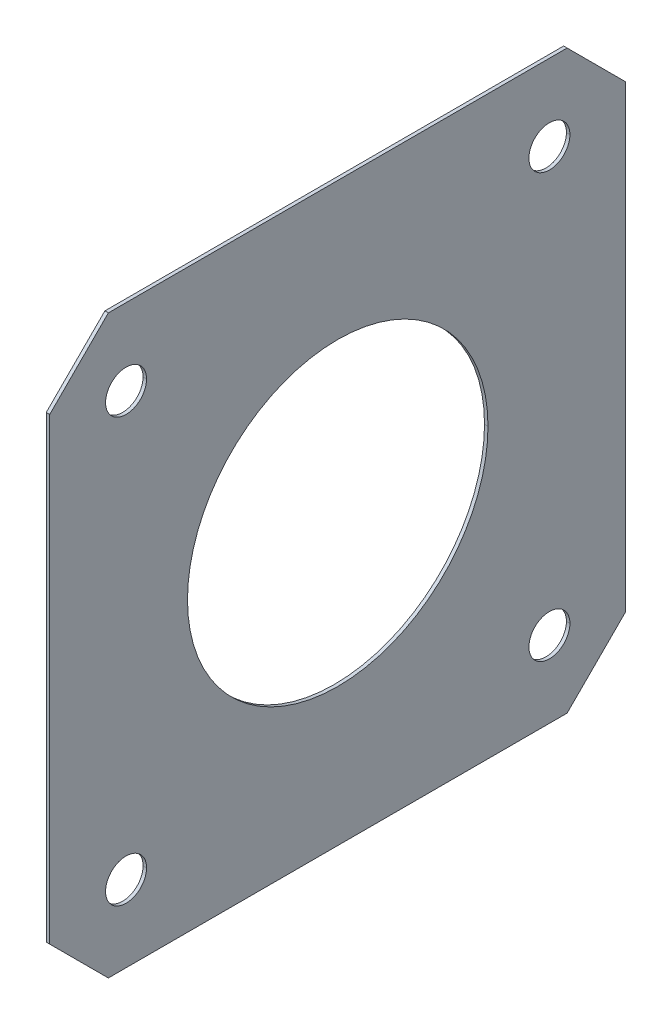
ISO-10303-21;
HEADER;
FILE_DESCRIPTION(('STEP AP214'),'2;1');
FILE_NAME('part.step','',(''),(''),'','','');
FILE_SCHEMA(('AUTOMOTIVE_DESIGN { 1 0 10303 214 1 1 1 1 }'));
ENDSEC;
DATA;
#1=APPLICATION_CONTEXT('core data for automotive mechanical design processes');
#2=APPLICATION_PROTOCOL_DEFINITION('international standard','automotive_design',2000,#1);
#3=PRODUCT_CONTEXT('',#1,'mechanical');
#4=PRODUCT('Part','Part','',(#3));
#5=PRODUCT_RELATED_PRODUCT_CATEGORY('part','',(#4));
#6=PRODUCT_DEFINITION_FORMATION('','',#4);
#7=PRODUCT_DEFINITION_CONTEXT('part definition',#1,'design');
#8=PRODUCT_DEFINITION('design','',#6,#7);
#9=PRODUCT_DEFINITION_SHAPE('','',#8);
#10=(LENGTH_UNIT() NAMED_UNIT(*) SI_UNIT(.MILLI.,.METRE.));
#11=(NAMED_UNIT(*) PLANE_ANGLE_UNIT() SI_UNIT($,.RADIAN.));
#12=(NAMED_UNIT(*) SI_UNIT($,.STERADIAN.) SOLID_ANGLE_UNIT());
#13=UNCERTAINTY_MEASURE_WITH_UNIT(LENGTH_MEASURE(1.E-05),#10,'distance_accuracy_value','');
#14=(GEOMETRIC_REPRESENTATION_CONTEXT(3) GLOBAL_UNCERTAINTY_ASSIGNED_CONTEXT((#13)) GLOBAL_UNIT_ASSIGNED_CONTEXT((#10,
#11,#12)) REPRESENTATION_CONTEXT('',''));
#15=CARTESIAN_POINT('',(0.,0.,0.));
#16=DIRECTION('',(0.,0.,1.));
#17=DIRECTION('',(1.,0.,0.));
#18=AXIS2_PLACEMENT_3D('',#15,#16,#17);
#19=CARTESIAN_POINT('',(0.254,0.,0.));
#20=DIRECTION('',(1.,0.,0.));
#21=DIRECTION('',(0.,0.,-1.));
#22=AXIS2_PLACEMENT_3D('',#19,#20,#21);
#23=PLANE('',#22);
#24=CARTESIAN_POINT('',(0.254,15.494,-15.494));
#25=DIRECTION('',(1.,0.,0.));
#26=DIRECTION('',(0.,0.,-1.));
#27=AXIS2_PLACEMENT_3D('',#24,#25,#26);
#28=CIRCLE('',#27,1.5);
#29=CARTESIAN_POINT('',(0.254,15.494,-16.994));
#30=VERTEX_POINT('',#29);
#31=CARTESIAN_POINT('',(0.254,15.494,-13.994));
#32=VERTEX_POINT('',#31);
#33=EDGE_CURVE('E11',#30,#32,#28,.T.);
#34=ORIENTED_EDGE('',*,*,#33,.F.);
#35=CARTESIAN_POINT('',(0.254,15.494,-15.494));
#36=DIRECTION('',(1.,0.,0.));
#37=DIRECTION('',(0.,0.,-1.));
#38=AXIS2_PLACEMENT_3D('',#35,#36,#37);
#39=CIRCLE('',#38,1.5);
#40=EDGE_CURVE('E24',#32,#30,#39,.T.);
#41=ORIENTED_EDGE('',*,*,#40,.F.);
#42=EDGE_LOOP('',(#34,#41));
#43=FACE_BOUND('',#42,.T.);
#44=CARTESIAN_POINT('',(0.254,15.494,15.494));
#45=DIRECTION('',(1.,0.,0.));
#46=DIRECTION('',(0.,0.,-1.));
#47=AXIS2_PLACEMENT_3D('',#44,#45,#46);
#48=CIRCLE('',#47,1.5);
#49=CARTESIAN_POINT('',(0.254,15.494,13.994));
#50=VERTEX_POINT('',#49);
#51=CARTESIAN_POINT('',(0.254,15.494,16.994));
#52=VERTEX_POINT('',#51);
#53=EDGE_CURVE('E332',#50,#52,#48,.T.);
#54=ORIENTED_EDGE('',*,*,#53,.F.);
#55=CARTESIAN_POINT('',(0.254,15.494,15.494));
#56=DIRECTION('',(1.,0.,0.));
#57=DIRECTION('',(0.,0.,-1.));
#58=AXIS2_PLACEMENT_3D('',#55,#56,#57);
#59=CIRCLE('',#58,1.5);
#60=EDGE_CURVE('E327',#52,#50,#59,.T.);
#61=ORIENTED_EDGE('',*,*,#60,.F.);
#62=EDGE_LOOP('',(#54,#61));
#63=FACE_BOUND('',#62,.T.);
#64=CARTESIAN_POINT('',(0.254,-15.494,-15.494));
#65=DIRECTION('',(1.,0.,0.));
#66=DIRECTION('',(0.,0.,-1.));
#67=AXIS2_PLACEMENT_3D('',#64,#65,#66);
#68=CIRCLE('',#67,1.5);
#69=CARTESIAN_POINT('',(0.254,-15.494,-16.994));
#70=VERTEX_POINT('',#69);
#71=CARTESIAN_POINT('',(0.254,-15.494,-13.994));
#72=VERTEX_POINT('',#71);
#73=EDGE_CURVE('E322',#70,#72,#68,.T.);
#74=ORIENTED_EDGE('',*,*,#73,.F.);
#75=CARTESIAN_POINT('',(0.254,-15.494,-15.494));
#76=DIRECTION('',(1.,0.,0.));
#77=DIRECTION('',(0.,0.,-1.));
#78=AXIS2_PLACEMENT_3D('',#75,#76,#77);
#79=CIRCLE('',#78,1.5);
#80=EDGE_CURVE('E317',#72,#70,#79,.T.);
#81=ORIENTED_EDGE('',*,*,#80,.F.);
#82=EDGE_LOOP('',(#74,#81));
#83=FACE_BOUND('',#82,.T.);
#84=CARTESIAN_POINT('',(0.254,-15.494,15.494));
#85=DIRECTION('',(1.,0.,0.));
#86=DIRECTION('',(0.,0.,-1.));
#87=AXIS2_PLACEMENT_3D('',#84,#85,#86);
#88=CIRCLE('',#87,1.5);
#89=CARTESIAN_POINT('',(0.254,-15.494,13.994));
#90=VERTEX_POINT('',#89);
#91=CARTESIAN_POINT('',(0.254,-15.494,16.994));
#92=VERTEX_POINT('',#91);
#93=EDGE_CURVE('E312',#90,#92,#88,.T.);
#94=ORIENTED_EDGE('',*,*,#93,.F.);
#95=CARTESIAN_POINT('',(0.254,-15.494,15.494));
#96=DIRECTION('',(1.,0.,0.));
#97=DIRECTION('',(0.,0.,-1.));
#98=AXIS2_PLACEMENT_3D('',#95,#96,#97);
#99=CIRCLE('',#98,1.5);
#100=EDGE_CURVE('E307',#92,#90,#99,.T.);
#101=ORIENTED_EDGE('',*,*,#100,.F.);
#102=EDGE_LOOP('',(#94,#101));
#103=FACE_BOUND('',#102,.T.);
#104=CARTESIAN_POINT('',(0.254,0.,0.));
#105=DIRECTION('',(1.,0.,0.));
#106=DIRECTION('',(0.,0.,-1.));
#107=AXIS2_PLACEMENT_3D('',#104,#105,#106);
#108=CIRCLE('',#107,10.9982);
#109=CARTESIAN_POINT('',(0.254,0.,-10.9982));
#110=VERTEX_POINT('',#109);
#111=CARTESIAN_POINT('',(0.254,0.,10.9982));
#112=VERTEX_POINT('',#111);
#113=EDGE_CURVE('E303',#110,#112,#108,.T.);
#114=ORIENTED_EDGE('',*,*,#113,.F.);
#115=CARTESIAN_POINT('',(0.254,0.,0.));
#116=DIRECTION('',(1.,0.,0.));
#117=DIRECTION('',(0.,0.,-1.));
#118=AXIS2_PLACEMENT_3D('',#115,#116,#117);
#119=CIRCLE('',#118,10.9982);
#120=EDGE_CURVE('E151',#112,#110,#119,.T.);
#121=ORIENTED_EDGE('',*,*,#120,.F.);
#122=EDGE_LOOP('',(#114,#121));
#123=FACE_BOUND('',#122,.T.);
#124=DIRECTION('',(0.,-1.,0.));
#125=VECTOR('',#124,1.);
#126=CARTESIAN_POINT('',(0.254,16.790416,21.082));
#127=LINE('',#126,#125);
#128=CARTESIAN_POINT('',(0.254,16.790416,21.082));
#129=VERTEX_POINT('',#128);
#130=CARTESIAN_POINT('',(0.254,-16.790416,21.082));
#131=VERTEX_POINT('',#130);
#132=EDGE_CURVE('E296',#129,#131,#127,.T.);
#133=ORIENTED_EDGE('',*,*,#132,.T.);
#134=DIRECTION('',(0.,-0.707106781186548,-0.707106781186548));
#135=VECTOR('',#134,1.);
#136=CARTESIAN_POINT('',(0.254,-16.790416,21.082));
#137=LINE('',#136,#135);
#138=CARTESIAN_POINT('',(0.254,-21.082,16.790416));
#139=VERTEX_POINT('',#138);
#140=EDGE_CURVE('E292',#131,#139,#137,.T.);
#141=ORIENTED_EDGE('',*,*,#140,.T.);
#142=DIRECTION('',(0.,0.,-1.));
#143=VECTOR('',#142,1.);
#144=CARTESIAN_POINT('',(0.254,-21.082,16.790416));
#145=LINE('',#144,#143);
#146=CARTESIAN_POINT('',(0.254,-21.082,-16.790416));
#147=VERTEX_POINT('',#146);
#148=EDGE_CURVE('E288',#139,#147,#145,.T.);
#149=ORIENTED_EDGE('',*,*,#148,.T.);
#150=DIRECTION('',(0.,0.707106781186548,-0.707106781186548));
#151=VECTOR('',#150,1.);
#152=CARTESIAN_POINT('',(0.254,-21.082,-16.790416));
#153=LINE('',#152,#151);
#154=CARTESIAN_POINT('',(0.254,-16.790416,-21.082));
#155=VERTEX_POINT('',#154);
#156=EDGE_CURVE('E284',#147,#155,#153,.T.);
#157=ORIENTED_EDGE('',*,*,#156,.T.);
#158=DIRECTION('',(0.,1.,0.));
#159=VECTOR('',#158,1.);
#160=CARTESIAN_POINT('',(0.254,-16.790416,-21.082));
#161=LINE('',#160,#159);
#162=CARTESIAN_POINT('',(0.254,16.790416,-21.082));
#163=VERTEX_POINT('',#162);
#164=EDGE_CURVE('E280',#155,#163,#161,.T.);
#165=ORIENTED_EDGE('',*,*,#164,.T.);
#166=DIRECTION('',(0.,0.707106781186548,0.707106781186548));
#167=VECTOR('',#166,1.);
#168=CARTESIAN_POINT('',(0.254,16.790416,-21.082));
#169=LINE('',#168,#167);
#170=CARTESIAN_POINT('',(0.254,21.082,-16.790416));
#171=VERTEX_POINT('',#170);
#172=EDGE_CURVE('E276',#163,#171,#169,.T.);
#173=ORIENTED_EDGE('',*,*,#172,.T.);
#174=DIRECTION('',(0.,0.,1.));
#175=VECTOR('',#174,1.);
#176=CARTESIAN_POINT('',(0.254,21.082,-16.790416));
#177=LINE('',#176,#175);
#178=CARTESIAN_POINT('',(0.254,21.082,16.790416));
#179=VERTEX_POINT('',#178);
#180=EDGE_CURVE('E272',#171,#179,#177,.T.);
#181=ORIENTED_EDGE('',*,*,#180,.T.);
#182=DIRECTION('',(0.,-0.707106781186548,0.707106781186548));
#183=VECTOR('',#182,1.);
#184=CARTESIAN_POINT('',(0.254,21.082,16.790416));
#185=LINE('',#184,#183);
#186=EDGE_CURVE('E268',#179,#129,#185,.T.);
#187=ORIENTED_EDGE('',*,*,#186,.T.);
#188=EDGE_LOOP('',(#133,#141,#149,#157,#165,#173,#181,#187));
#189=FACE_BOUND('',#188,.T.);
#190=ADVANCED_FACE('F16',(#43,#63,#83,#103,#123,#189),#23,.T.);
#191=CARTESIAN_POINT('',(0.254,21.082,16.790416));
#192=DIRECTION('',(0.,-0.707106781186548,-0.707106781186548));
#193=DIRECTION('',(0.,0.707106781186548,-0.707106781186548));
#194=AXIS2_PLACEMENT_3D('',#191,#192,#193);
#195=PLANE('',#194);
#196=DIRECTION('',(0.,-0.707106781186548,0.707106781186548));
#197=VECTOR('',#196,1.);
#198=CARTESIAN_POINT('',(0.,21.082,16.790416));
#199=LINE('',#198,#197);
#200=CARTESIAN_POINT('',(0.,21.082,16.790416));
#201=VERTEX_POINT('',#200);
#202=CARTESIAN_POINT('',(0.,16.790416,21.082));
#203=VERTEX_POINT('',#202);
#204=EDGE_CURVE('E264',#201,#203,#199,.T.);
#205=ORIENTED_EDGE('',*,*,#204,.T.);
#206=DIRECTION('',(-1.,0.,0.));
#207=VECTOR('',#206,1.);
#208=CARTESIAN_POINT('',(0.254,16.790416,21.082));
#209=LINE('',#208,#207);
#210=EDGE_CURVE('E259',#129,#203,#209,.T.);
#211=ORIENTED_EDGE('',*,*,#210,.F.);
#212=ORIENTED_EDGE('',*,*,#186,.F.);
#213=DIRECTION('',(-1.,0.,0.));
#214=VECTOR('',#213,1.);
#215=CARTESIAN_POINT('',(0.254,21.082,16.790416));
#216=LINE('',#215,#214);
#217=EDGE_CURVE('E255',#179,#201,#216,.T.);
#218=ORIENTED_EDGE('',*,*,#217,.T.);
#219=EDGE_LOOP('',(#205,#211,#212,#218));
#220=FACE_BOUND('',#219,.T.);
#221=ADVANCED_FACE('F594',(#220),#195,.F.);
#222=CARTESIAN_POINT('',(0.254,21.082,-16.790416));
#223=DIRECTION('',(0.,-1.,0.));
#224=DIRECTION('',(0.,0.,-1.));
#225=AXIS2_PLACEMENT_3D('',#222,#223,#224);
#226=PLANE('',#225);
#227=DIRECTION('',(0.,0.,1.));
#228=VECTOR('',#227,1.);
#229=CARTESIAN_POINT('',(0.,21.082,-16.790416));
#230=LINE('',#229,#228);
#231=CARTESIAN_POINT('',(0.,21.082,-16.790416));
#232=VERTEX_POINT('',#231);
#233=EDGE_CURVE('E250',#232,#201,#230,.T.);
#234=ORIENTED_EDGE('',*,*,#233,.T.);
#235=ORIENTED_EDGE('',*,*,#217,.F.);
#236=ORIENTED_EDGE('',*,*,#180,.F.);
#237=DIRECTION('',(-1.,0.,0.));
#238=VECTOR('',#237,1.);
#239=CARTESIAN_POINT('',(0.254,21.082,-16.790416));
#240=LINE('',#239,#238);
#241=EDGE_CURVE('E246',#171,#232,#240,.T.);
#242=ORIENTED_EDGE('',*,*,#241,.T.);
#243=EDGE_LOOP('',(#234,#235,#236,#242));
#244=FACE_BOUND('',#243,.T.);
#245=ADVANCED_FACE('F631',(#244),#226,.F.);
#246=CARTESIAN_POINT('',(0.254,16.790416,-21.082));
#247=DIRECTION('',(0.,-0.707106781186548,0.707106781186548));
#248=DIRECTION('',(0.,-0.707106781186548,-0.707106781186548));
#249=AXIS2_PLACEMENT_3D('',#246,#247,#248);
#250=PLANE('',#249);
#251=DIRECTION('',(0.,0.707106781186548,0.707106781186548));
#252=VECTOR('',#251,1.);
#253=CARTESIAN_POINT('',(0.,16.790416,-21.082));
#254=LINE('',#253,#252);
#255=CARTESIAN_POINT('',(0.,16.790416,-21.082));
#256=VERTEX_POINT('',#255);
#257=EDGE_CURVE('E241',#256,#232,#254,.T.);
#258=ORIENTED_EDGE('',*,*,#257,.T.);
#259=ORIENTED_EDGE('',*,*,#241,.F.);
#260=ORIENTED_EDGE('',*,*,#172,.F.);
#261=DIRECTION('',(-1.,0.,0.));
#262=VECTOR('',#261,1.);
#263=CARTESIAN_POINT('',(0.254,16.790416,-21.082));
#264=LINE('',#263,#262);
#265=EDGE_CURVE('E237',#163,#256,#264,.T.);
#266=ORIENTED_EDGE('',*,*,#265,.T.);
#267=EDGE_LOOP('',(#258,#259,#260,#266));
#268=FACE_BOUND('',#267,.T.);
#269=ADVANCED_FACE('F628',(#268),#250,.F.);
#270=CARTESIAN_POINT('',(0.254,-16.790416,-21.082));
#271=DIRECTION('',(0.,0.,1.));
#272=DIRECTION('',(1.,0.,0.));
#273=AXIS2_PLACEMENT_3D('',#270,#271,#272);
#274=PLANE('',#273);
#275=DIRECTION('',(0.,1.,0.));
#276=VECTOR('',#275,1.);
#277=CARTESIAN_POINT('',(0.,-16.790416,-21.082));
#278=LINE('',#277,#276);
#279=CARTESIAN_POINT('',(0.,-16.790416,-21.082));
#280=VERTEX_POINT('',#279);
#281=EDGE_CURVE('E232',#280,#256,#278,.T.);
#282=ORIENTED_EDGE('',*,*,#281,.T.);
#283=ORIENTED_EDGE('',*,*,#265,.F.);
#284=ORIENTED_EDGE('',*,*,#164,.F.);
#285=DIRECTION('',(-1.,0.,0.));
#286=VECTOR('',#285,1.);
#287=CARTESIAN_POINT('',(0.254,-16.790416,-21.082));
#288=LINE('',#287,#286);
#289=EDGE_CURVE('E228',#155,#280,#288,.T.);
#290=ORIENTED_EDGE('',*,*,#289,.T.);
#291=EDGE_LOOP('',(#282,#283,#284,#290));
#292=FACE_BOUND('',#291,.T.);
#293=ADVANCED_FACE('F621',(#292),#274,.F.);
#294=CARTESIAN_POINT('',(0.254,-21.082,-16.790416));
#295=DIRECTION('',(0.,0.707106781186548,0.707106781186548));
#296=DIRECTION('',(0.,-0.707106781186548,0.707106781186548));
#297=AXIS2_PLACEMENT_3D('',#294,#295,#296);
#298=PLANE('',#297);
#299=DIRECTION('',(0.,0.707106781186548,-0.707106781186548));
#300=VECTOR('',#299,1.);
#301=CARTESIAN_POINT('',(0.,-21.082,-16.790416));
#302=LINE('',#301,#300);
#303=CARTESIAN_POINT('',(0.,-21.082,-16.790416));
#304=VERTEX_POINT('',#303);
#305=EDGE_CURVE('E223',#304,#280,#302,.T.);
#306=ORIENTED_EDGE('',*,*,#305,.T.);
#307=ORIENTED_EDGE('',*,*,#289,.F.);
#308=ORIENTED_EDGE('',*,*,#156,.F.);
#309=DIRECTION('',(-1.,0.,0.));
#310=VECTOR('',#309,1.);
#311=CARTESIAN_POINT('',(0.254,-21.082,-16.790416));
#312=LINE('',#311,#310);
#313=EDGE_CURVE('E219',#147,#304,#312,.T.);
#314=ORIENTED_EDGE('',*,*,#313,.T.);
#315=EDGE_LOOP('',(#306,#307,#308,#314));
#316=FACE_BOUND('',#315,.T.);
#317=ADVANCED_FACE('F619',(#316),#298,.F.);
#318=CARTESIAN_POINT('',(0.254,-21.082,16.790416));
#319=DIRECTION('',(0.,1.,0.));
#320=DIRECTION('',(0.,0.,1.));
#321=AXIS2_PLACEMENT_3D('',#318,#319,#320);
#322=PLANE('',#321);
#323=DIRECTION('',(0.,0.,-1.));
#324=VECTOR('',#323,1.);
#325=CARTESIAN_POINT('',(0.,-21.082,16.790416));
#326=LINE('',#325,#324);
#327=CARTESIAN_POINT('',(0.,-21.082,16.790416));
#328=VERTEX_POINT('',#327);
#329=EDGE_CURVE('E214',#328,#304,#326,.T.);
#330=ORIENTED_EDGE('',*,*,#329,.T.);
#331=ORIENTED_EDGE('',*,*,#313,.F.);
#332=ORIENTED_EDGE('',*,*,#148,.F.);
#333=DIRECTION('',(-1.,0.,0.));
#334=VECTOR('',#333,1.);
#335=CARTESIAN_POINT('',(0.254,-21.082,16.790416));
#336=LINE('',#335,#334);
#337=EDGE_CURVE('E210',#139,#328,#336,.T.);
#338=ORIENTED_EDGE('',*,*,#337,.T.);
#339=EDGE_LOOP('',(#330,#331,#332,#338));
#340=FACE_BOUND('',#339,.T.);
#341=ADVANCED_FACE('F614',(#340),#322,.F.);
#342=CARTESIAN_POINT('',(0.254,-16.790416,21.082));
#343=DIRECTION('',(0.,0.707106781186548,-0.707106781186548));
#344=DIRECTION('',(0.,0.707106781186548,0.707106781186548));
#345=AXIS2_PLACEMENT_3D('',#342,#343,#344);
#346=PLANE('',#345);
#347=DIRECTION('',(0.,-0.707106781186548,-0.707106781186548));
#348=VECTOR('',#347,1.);
#349=CARTESIAN_POINT('',(0.,-16.790416,21.082));
#350=LINE('',#349,#348);
#351=CARTESIAN_POINT('',(0.,-16.790416,21.082));
#352=VERTEX_POINT('',#351);
#353=EDGE_CURVE('E205',#352,#328,#350,.T.);
#354=ORIENTED_EDGE('',*,*,#353,.T.);
#355=ORIENTED_EDGE('',*,*,#337,.F.);
#356=ORIENTED_EDGE('',*,*,#140,.F.);
#357=DIRECTION('',(-1.,0.,0.));
#358=VECTOR('',#357,1.);
#359=CARTESIAN_POINT('',(0.254,-16.790416,21.082));
#360=LINE('',#359,#358);
#361=EDGE_CURVE('E201',#131,#352,#360,.T.);
#362=ORIENTED_EDGE('',*,*,#361,.T.);
#363=EDGE_LOOP('',(#354,#355,#356,#362));
#364=FACE_BOUND('',#363,.T.);
#365=ADVANCED_FACE('F604',(#364),#346,.F.);
#366=CARTESIAN_POINT('',(0.254,16.790416,21.082));
#367=DIRECTION('',(0.,0.,-1.));
#368=DIRECTION('',(-1.,0.,0.));
#369=AXIS2_PLACEMENT_3D('',#366,#367,#368);
#370=PLANE('',#369);
#371=DIRECTION('',(0.,-1.,0.));
#372=VECTOR('',#371,1.);
#373=CARTESIAN_POINT('',(0.,16.790416,21.082));
#374=LINE('',#373,#372);
#375=EDGE_CURVE('E196',#203,#352,#374,.T.);
#376=ORIENTED_EDGE('',*,*,#375,.T.);
#377=ORIENTED_EDGE('',*,*,#361,.F.);
#378=ORIENTED_EDGE('',*,*,#132,.F.);
#379=ORIENTED_EDGE('',*,*,#210,.T.);
#380=EDGE_LOOP('',(#376,#377,#378,#379));
#381=FACE_BOUND('',#380,.T.);
#382=ADVANCED_FACE('F605',(#381),#370,.F.);
#383=CARTESIAN_POINT('',(0.,0.,0.));
#384=DIRECTION('',(1.,0.,0.));
#385=DIRECTION('',(0.,0.,-1.));
#386=AXIS2_PLACEMENT_3D('',#383,#384,#385);
#387=PLANE('',#386);
#388=CARTESIAN_POINT('',(0.,15.494,-15.494));
#389=DIRECTION('',(1.,0.,0.));
#390=DIRECTION('',(0.,0.,-1.));
#391=AXIS2_PLACEMENT_3D('',#388,#389,#390);
#392=CIRCLE('',#391,1.5);
#393=CARTESIAN_POINT('',(0.,15.494,-16.994));
#394=VERTEX_POINT('',#393);
#395=CARTESIAN_POINT('',(0.,15.494,-13.994));
#396=VERTEX_POINT('',#395);
#397=EDGE_CURVE('E192',#394,#396,#392,.T.);
#398=ORIENTED_EDGE('',*,*,#397,.T.);
#399=CARTESIAN_POINT('',(0.,15.494,-15.494));
#400=DIRECTION('',(1.,0.,0.));
#401=DIRECTION('',(0.,0.,-1.));
#402=AXIS2_PLACEMENT_3D('',#399,#400,#401);
#403=CIRCLE('',#402,1.5);
#404=EDGE_CURVE('E188',#396,#394,#403,.T.);
#405=ORIENTED_EDGE('',*,*,#404,.T.);
#406=EDGE_LOOP('',(#398,#405));
#407=FACE_BOUND('',#406,.T.);
#408=CARTESIAN_POINT('',(0.,15.494,15.494));
#409=DIRECTION('',(1.,0.,0.));
#410=DIRECTION('',(0.,0.,-1.));
#411=AXIS2_PLACEMENT_3D('',#408,#409,#410);
#412=CIRCLE('',#411,1.5);
#413=CARTESIAN_POINT('',(0.,15.494,13.994));
#414=VERTEX_POINT('',#413);
#415=CARTESIAN_POINT('',(0.,15.494,16.994));
#416=VERTEX_POINT('',#415);
#417=EDGE_CURVE('E184',#414,#416,#412,.T.);
#418=ORIENTED_EDGE('',*,*,#417,.T.);
#419=CARTESIAN_POINT('',(0.,15.494,15.494));
#420=DIRECTION('',(1.,0.,0.));
#421=DIRECTION('',(0.,0.,-1.));
#422=AXIS2_PLACEMENT_3D('',#419,#420,#421);
#423=CIRCLE('',#422,1.5);
#424=EDGE_CURVE('E180',#416,#414,#423,.T.);
#425=ORIENTED_EDGE('',*,*,#424,.T.);
#426=EDGE_LOOP('',(#418,#425));
#427=FACE_BOUND('',#426,.T.);
#428=CARTESIAN_POINT('',(0.,-15.494,-15.494));
#429=DIRECTION('',(1.,0.,0.));
#430=DIRECTION('',(0.,0.,-1.));
#431=AXIS2_PLACEMENT_3D('',#428,#429,#430);
#432=CIRCLE('',#431,1.5);
#433=CARTESIAN_POINT('',(0.,-15.494,-16.994));
#434=VERTEX_POINT('',#433);
#435=CARTESIAN_POINT('',(0.,-15.494,-13.994));
#436=VERTEX_POINT('',#435);
#437=EDGE_CURVE('E176',#434,#436,#432,.T.);
#438=ORIENTED_EDGE('',*,*,#437,.T.);
#439=CARTESIAN_POINT('',(0.,-15.494,-15.494));
#440=DIRECTION('',(1.,0.,0.));
#441=DIRECTION('',(0.,0.,-1.));
#442=AXIS2_PLACEMENT_3D('',#439,#440,#441);
#443=CIRCLE('',#442,1.5);
#444=EDGE_CURVE('E172',#436,#434,#443,.T.);
#445=ORIENTED_EDGE('',*,*,#444,.T.);
#446=EDGE_LOOP('',(#438,#445));
#447=FACE_BOUND('',#446,.T.);
#448=CARTESIAN_POINT('',(0.,-15.494,15.494));
#449=DIRECTION('',(1.,0.,0.));
#450=DIRECTION('',(0.,0.,-1.));
#451=AXIS2_PLACEMENT_3D('',#448,#449,#450);
#452=CIRCLE('',#451,1.5);
#453=CARTESIAN_POINT('',(0.,-15.494,13.994));
#454=VERTEX_POINT('',#453);
#455=CARTESIAN_POINT('',(0.,-15.494,16.994));
#456=VERTEX_POINT('',#455);
#457=EDGE_CURVE('E162',#454,#456,#452,.T.);
#458=ORIENTED_EDGE('',*,*,#457,.T.);
#459=CARTESIAN_POINT('',(0.,-15.494,15.494));
#460=DIRECTION('',(1.,0.,0.));
#461=DIRECTION('',(0.,0.,-1.));
#462=AXIS2_PLACEMENT_3D('',#459,#460,#461);
#463=CIRCLE('',#462,1.5);
#464=EDGE_CURVE('E160',#456,#454,#463,.T.);
#465=ORIENTED_EDGE('',*,*,#464,.T.);
#466=EDGE_LOOP('',(#458,#465));
#467=FACE_BOUND('',#466,.T.);
#468=CARTESIAN_POINT('',(0.,0.,0.));
#469=DIRECTION('',(1.,0.,0.));
#470=DIRECTION('',(0.,0.,-1.));
#471=AXIS2_PLACEMENT_3D('',#468,#469,#470);
#472=CIRCLE('',#471,10.9982);
#473=CARTESIAN_POINT('',(0.,0.,-10.9982));
#474=VERTEX_POINT('',#473);
#475=CARTESIAN_POINT('',(0.,0.,10.9982));
#476=VERTEX_POINT('',#475);
#477=EDGE_CURVE('E140',#474,#476,#472,.T.);
#478=ORIENTED_EDGE('',*,*,#477,.T.);
#479=CARTESIAN_POINT('',(0.,0.,0.));
#480=DIRECTION('',(1.,0.,0.));
#481=DIRECTION('',(0.,0.,-1.));
#482=AXIS2_PLACEMENT_3D('',#479,#480,#481);
#483=CIRCLE('',#482,10.9982);
#484=EDGE_CURVE('E135',#476,#474,#483,.T.);
#485=ORIENTED_EDGE('',*,*,#484,.T.);
#486=EDGE_LOOP('',(#478,#485));
#487=FACE_BOUND('',#486,.T.);
#488=ORIENTED_EDGE('',*,*,#375,.F.);
#489=ORIENTED_EDGE('',*,*,#204,.F.);
#490=ORIENTED_EDGE('',*,*,#233,.F.);
#491=ORIENTED_EDGE('',*,*,#257,.F.);
#492=ORIENTED_EDGE('',*,*,#281,.F.);
#493=ORIENTED_EDGE('',*,*,#305,.F.);
#494=ORIENTED_EDGE('',*,*,#329,.F.);
#495=ORIENTED_EDGE('',*,*,#353,.F.);
#496=EDGE_LOOP('',(#488,#489,#490,#491,#492,#493,#494,#495));
#497=FACE_BOUND('',#496,.T.);
#498=ADVANCED_FACE('F137',(#407,#427,#447,#467,#487,#497),#387,.F.);
#499=CARTESIAN_POINT('',(0.254,0.,0.));
#500=DIRECTION('',(1.,0.,0.));
#501=DIRECTION('',(0.,1.,0.));
#502=AXIS2_PLACEMENT_3D('',#499,#500,#501);
#503=CYLINDRICAL_SURFACE('',#502,10.9982);
#504=ORIENTED_EDGE('',*,*,#484,.F.);
#505=CARTESIAN_POINT('',(0.,0.,10.9982));
#506=DIRECTION('',(1.,0.,0.));
#507=VECTOR('',#506,1.);
#508=LINE('',#505,#507);
#509=EDGE_CURVE('E144',#476,#112,#508,.T.);
#510=ORIENTED_EDGE('',*,*,#509,.T.);
#511=ORIENTED_EDGE('',*,*,#120,.T.);
#512=CARTESIAN_POINT('',(0.,0.,-10.9982));
#513=DIRECTION('',(1.,0.,0.));
#514=VECTOR('',#513,1.);
#515=LINE('',#512,#514);
#516=EDGE_CURVE('E148',#474,#110,#515,.T.);
#517=ORIENTED_EDGE('',*,*,#516,.F.);
#518=EDGE_LOOP('',(#504,#510,#511,#517));
#519=FACE_BOUND('',#518,.T.);
#520=ADVANCED_FACE('F150',(#519),#503,.F.);
#521=CARTESIAN_POINT('',(0.254,0.,0.));
#522=DIRECTION('',(1.,0.,0.));
#523=DIRECTION('',(0.,-1.,0.));
#524=AXIS2_PLACEMENT_3D('',#521,#522,#523);
#525=CYLINDRICAL_SURFACE('',#524,10.9982);
#526=ORIENTED_EDGE('',*,*,#113,.T.);
#527=ORIENTED_EDGE('',*,*,#509,.F.);
#528=ORIENTED_EDGE('',*,*,#477,.F.);
#529=ORIENTED_EDGE('',*,*,#516,.T.);
#530=EDGE_LOOP('',(#526,#527,#528,#529));
#531=FACE_BOUND('',#530,.T.);
#532=ADVANCED_FACE('F158',(#531),#525,.F.);
#533=CARTESIAN_POINT('',(0.254,-15.494,15.494));
#534=DIRECTION('',(-1.,0.,0.));
#535=DIRECTION('',(0.,1.,0.));
#536=AXIS2_PLACEMENT_3D('',#533,#534,#535);
#537=CYLINDRICAL_SURFACE('',#536,1.5);
#538=ORIENTED_EDGE('',*,*,#464,.F.);
#539=CARTESIAN_POINT('',(0.254,-15.494,16.994));
#540=DIRECTION('',(-1.,0.,0.));
#541=VECTOR('',#540,1.);
#542=LINE('',#539,#541);
#543=EDGE_CURVE('E155',#92,#456,#542,.T.);
#544=ORIENTED_EDGE('',*,*,#543,.F.);
#545=ORIENTED_EDGE('',*,*,#100,.T.);
#546=CARTESIAN_POINT('',(0.254,-15.494,13.994));
#547=DIRECTION('',(-1.,0.,0.));
#548=VECTOR('',#547,1.);
#549=LINE('',#546,#548);
#550=EDGE_CURVE('E517',#90,#454,#549,.T.);
#551=ORIENTED_EDGE('',*,*,#550,.T.);
#552=EDGE_LOOP('',(#538,#544,#545,#551));
#553=FACE_BOUND('',#552,.T.);
#554=ADVANCED_FACE('F533',(#553),#537,.F.);
#555=CARTESIAN_POINT('',(0.254,-15.494,15.494));
#556=DIRECTION('',(-1.,0.,0.));
#557=DIRECTION('',(0.,-1.,0.));
#558=AXIS2_PLACEMENT_3D('',#555,#556,#557);
#559=CYLINDRICAL_SURFACE('',#558,1.5);
#560=ORIENTED_EDGE('',*,*,#93,.T.);
#561=ORIENTED_EDGE('',*,*,#543,.T.);
#562=ORIENTED_EDGE('',*,*,#457,.F.);
#563=ORIENTED_EDGE('',*,*,#550,.F.);
#564=EDGE_LOOP('',(#560,#561,#562,#563));
#565=FACE_BOUND('',#564,.T.);
#566=ADVANCED_FACE('F489',(#565),#559,.F.);
#567=CARTESIAN_POINT('',(0.254,-15.494,-15.494));
#568=DIRECTION('',(-1.,0.,0.));
#569=DIRECTION('',(0.,1.,0.));
#570=AXIS2_PLACEMENT_3D('',#567,#568,#569);
#571=CYLINDRICAL_SURFACE('',#570,1.5);
#572=ORIENTED_EDGE('',*,*,#444,.F.);
#573=CARTESIAN_POINT('',(0.254,-15.494,-13.994));
#574=DIRECTION('',(-1.,0.,0.));
#575=VECTOR('',#574,1.);
#576=LINE('',#573,#575);
#577=EDGE_CURVE('E475',#72,#436,#576,.T.);
#578=ORIENTED_EDGE('',*,*,#577,.F.);
#579=ORIENTED_EDGE('',*,*,#80,.T.);
#580=CARTESIAN_POINT('',(0.254,-15.494,-16.994));
#581=DIRECTION('',(-1.,0.,0.));
#582=VECTOR('',#581,1.);
#583=LINE('',#580,#582);
#584=EDGE_CURVE('E463',#70,#434,#583,.T.);
#585=ORIENTED_EDGE('',*,*,#584,.T.);
#586=EDGE_LOOP('',(#572,#578,#579,#585));
#587=FACE_BOUND('',#586,.T.);
#588=ADVANCED_FACE('F480',(#587),#571,.F.);
#589=CARTESIAN_POINT('',(0.254,-15.494,-15.494));
#590=DIRECTION('',(-1.,0.,0.));
#591=DIRECTION('',(0.,-1.,0.));
#592=AXIS2_PLACEMENT_3D('',#589,#590,#591);
#593=CYLINDRICAL_SURFACE('',#592,1.5);
#594=ORIENTED_EDGE('',*,*,#73,.T.);
#595=ORIENTED_EDGE('',*,*,#577,.T.);
#596=ORIENTED_EDGE('',*,*,#437,.F.);
#597=ORIENTED_EDGE('',*,*,#584,.F.);
#598=EDGE_LOOP('',(#594,#595,#596,#597));
#599=FACE_BOUND('',#598,.T.);
#600=ADVANCED_FACE('F435',(#599),#593,.F.);
#601=CARTESIAN_POINT('',(0.254,15.494,15.494));
#602=DIRECTION('',(-1.,0.,0.));
#603=DIRECTION('',(0.,1.,0.));
#604=AXIS2_PLACEMENT_3D('',#601,#602,#603);
#605=CYLINDRICAL_SURFACE('',#604,1.5);
#606=ORIENTED_EDGE('',*,*,#424,.F.);
#607=CARTESIAN_POINT('',(0.254,15.494,16.994));
#608=DIRECTION('',(-1.,0.,0.));
#609=VECTOR('',#608,1.);
#610=LINE('',#607,#609);
#611=EDGE_CURVE('E421',#52,#416,#610,.T.);
#612=ORIENTED_EDGE('',*,*,#611,.F.);
#613=ORIENTED_EDGE('',*,*,#60,.T.);
#614=CARTESIAN_POINT('',(0.254,15.494,13.994));
#615=DIRECTION('',(-1.,0.,0.));
#616=VECTOR('',#615,1.);
#617=LINE('',#614,#616);
#618=EDGE_CURVE('E409',#50,#414,#617,.T.);
#619=ORIENTED_EDGE('',*,*,#618,.T.);
#620=EDGE_LOOP('',(#606,#612,#613,#619));
#621=FACE_BOUND('',#620,.T.);
#622=ADVANCED_FACE('F426',(#621),#605,.F.);
#623=CARTESIAN_POINT('',(0.254,15.494,15.494));
#624=DIRECTION('',(-1.,0.,0.));
#625=DIRECTION('',(0.,-1.,0.));
#626=AXIS2_PLACEMENT_3D('',#623,#624,#625);
#627=CYLINDRICAL_SURFACE('',#626,1.5);
#628=ORIENTED_EDGE('',*,*,#53,.T.);
#629=ORIENTED_EDGE('',*,*,#611,.T.);
#630=ORIENTED_EDGE('',*,*,#417,.F.);
#631=ORIENTED_EDGE('',*,*,#618,.F.);
#632=EDGE_LOOP('',(#628,#629,#630,#631));
#633=FACE_BOUND('',#632,.T.);
#634=ADVANCED_FACE('F376',(#633),#627,.F.);
#635=CARTESIAN_POINT('',(0.254,15.494,-15.494));
#636=DIRECTION('',(-1.,0.,0.));
#637=DIRECTION('',(0.,1.,0.));
#638=AXIS2_PLACEMENT_3D('',#635,#636,#637);
#639=CYLINDRICAL_SURFACE('',#638,1.5);
#640=ORIENTED_EDGE('',*,*,#404,.F.);
#641=CARTESIAN_POINT('',(0.254,15.494,-13.994));
#642=DIRECTION('',(-1.,0.,0.));
#643=VECTOR('',#642,1.);
#644=LINE('',#641,#643);
#645=EDGE_CURVE('E350',#32,#396,#644,.T.);
#646=ORIENTED_EDGE('',*,*,#645,.F.);
#647=ORIENTED_EDGE('',*,*,#40,.T.);
#648=CARTESIAN_POINT('',(0.254,15.494,-16.994));
#649=DIRECTION('',(-1.,0.,0.));
#650=VECTOR('',#649,1.);
#651=LINE('',#648,#650);
#652=EDGE_CURVE('E346',#30,#394,#651,.T.);
#653=ORIENTED_EDGE('',*,*,#652,.T.);
#654=EDGE_LOOP('',(#640,#646,#647,#653));
#655=FACE_BOUND('',#654,.T.);
#656=ADVANCED_FACE('F345',(#655),#639,.F.);
#657=CARTESIAN_POINT('',(0.254,15.494,-15.494));
#658=DIRECTION('',(-1.,0.,0.));
#659=DIRECTION('',(0.,-1.,0.));
#660=AXIS2_PLACEMENT_3D('',#657,#658,#659);
#661=CYLINDRICAL_SURFACE('',#660,1.5);
#662=ORIENTED_EDGE('',*,*,#33,.T.);
#663=ORIENTED_EDGE('',*,*,#645,.T.);
#664=ORIENTED_EDGE('',*,*,#397,.F.);
#665=ORIENTED_EDGE('',*,*,#652,.F.);
#666=EDGE_LOOP('',(#662,#663,#664,#665));
#667=FACE_BOUND('',#666,.T.);
#668=ADVANCED_FACE('F354',(#667),#661,.F.);
#669=CLOSED_SHELL('',(#190,#221,#245,#269,#293,#317,#341,#365,#382,#498,#520,#532,#554,#566,
#588,#600,#622,#634,#656,#668));
#670=MANIFOLD_SOLID_BREP('B1',#669);
#671=ADVANCED_BREP_SHAPE_REPRESENTATION('',(#18,#670),#14);
#672=SHAPE_DEFINITION_REPRESENTATION(#9,#671);
ENDSEC;
END-ISO-10303-21;
